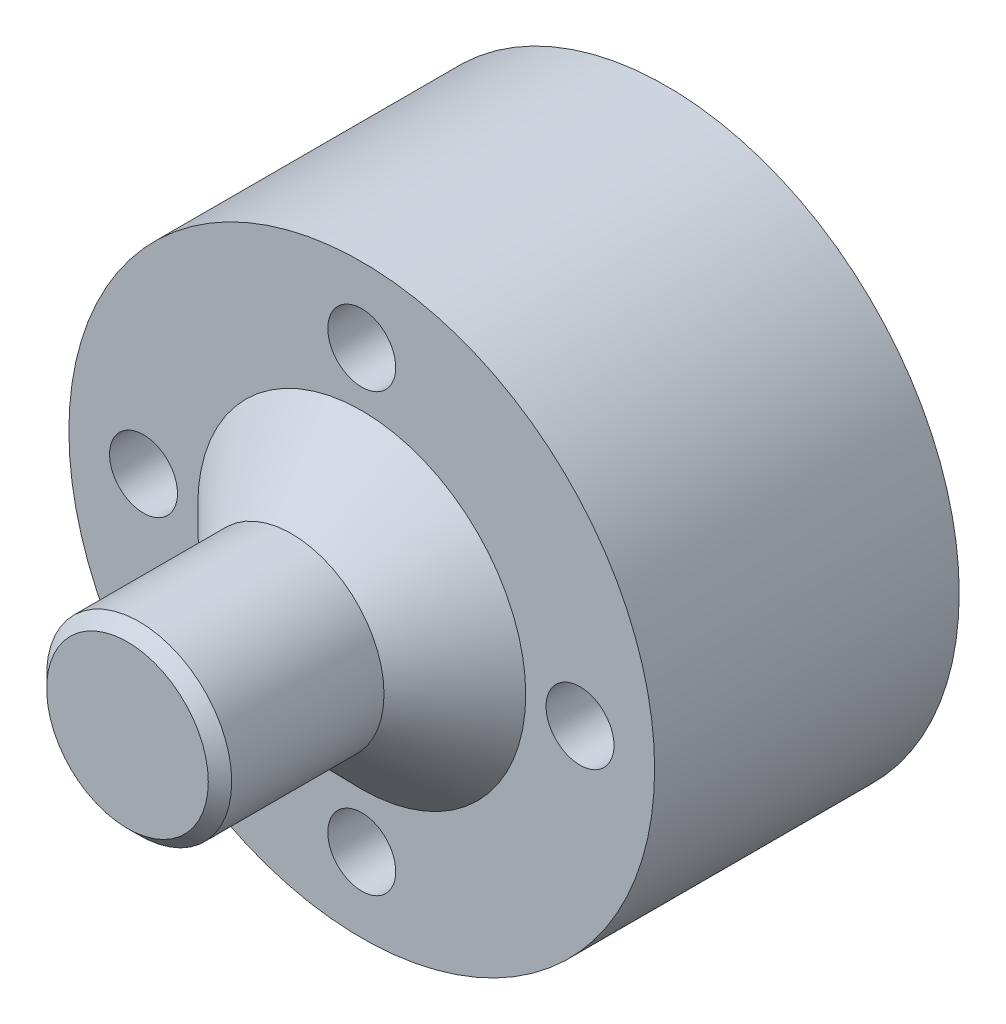
ISO-10303-21;
HEADER;
FILE_DESCRIPTION(('STEP AP214'),'2;1');
FILE_NAME('part.step','',(''),(''),'','','');
FILE_SCHEMA(('AUTOMOTIVE_DESIGN { 1 0 10303 214 1 1 1 1 }'));
ENDSEC;
DATA;
#1=APPLICATION_CONTEXT('core data for automotive mechanical design processes');
#2=APPLICATION_PROTOCOL_DEFINITION('international standard','automotive_design',2000,#1);
#3=PRODUCT_CONTEXT('',#1,'mechanical');
#4=PRODUCT('Part','Part','',(#3));
#5=PRODUCT_RELATED_PRODUCT_CATEGORY('part','',(#4));
#6=PRODUCT_DEFINITION_FORMATION('','',#4);
#7=PRODUCT_DEFINITION_CONTEXT('part definition',#1,'design');
#8=PRODUCT_DEFINITION('design','',#6,#7);
#9=PRODUCT_DEFINITION_SHAPE('','',#8);
#10=(LENGTH_UNIT() NAMED_UNIT(*) SI_UNIT(.MILLI.,.METRE.));
#11=(NAMED_UNIT(*) PLANE_ANGLE_UNIT() SI_UNIT($,.RADIAN.));
#12=(NAMED_UNIT(*) SI_UNIT($,.STERADIAN.) SOLID_ANGLE_UNIT());
#13=UNCERTAINTY_MEASURE_WITH_UNIT(LENGTH_MEASURE(1.E-05),#10,'distance_accuracy_value','');
#14=(GEOMETRIC_REPRESENTATION_CONTEXT(3) GLOBAL_UNCERTAINTY_ASSIGNED_CONTEXT((#13)) GLOBAL_UNIT_ASSIGNED_CONTEXT((#10,
#11,#12)) REPRESENTATION_CONTEXT('',''));
#15=CARTESIAN_POINT('',(0.,0.,0.));
#16=DIRECTION('',(0.,0.,1.));
#17=DIRECTION('',(1.,0.,0.));
#18=AXIS2_PLACEMENT_3D('',#15,#16,#17);
#19=CARTESIAN_POINT('',(0.,0.,4.));
#20=DIRECTION('',(0.,0.,-1.));
#21=DIRECTION('',(-1.,0.,0.));
#22=AXIS2_PLACEMENT_3D('',#19,#20,#21);
#23=CYLINDRICAL_SURFACE('',#22,12.5);
#24=CARTESIAN_POINT('',(0.,0.,-4.));
#25=DIRECTION('',(0.,0.,1.));
#26=DIRECTION('',(1.,0.,0.));
#27=AXIS2_PLACEMENT_3D('',#24,#25,#26);
#28=CIRCLE('',#27,12.5);
#29=CARTESIAN_POINT('',(12.5,0.,-4.));
#30=VERTEX_POINT('',#29);
#31=EDGE_CURVE('E104',#30,#30,#28,.T.);
#32=ORIENTED_EDGE('',*,*,#31,.T.);
#33=EDGE_LOOP('',(#32));
#34=FACE_BOUND('',#33,.T.);
#35=CARTESIAN_POINT('',(0.,0.,9.));
#36=DIRECTION('',(0.,0.,1.));
#37=DIRECTION('',(1.,0.,0.));
#38=AXIS2_PLACEMENT_3D('',#35,#36,#37);
#39=CIRCLE('',#38,12.5);
#40=CARTESIAN_POINT('',(12.5,0.,9.));
#41=VERTEX_POINT('',#40);
#42=EDGE_CURVE('E109',#41,#41,#39,.T.);
#43=ORIENTED_EDGE('',*,*,#42,.F.);
#44=EDGE_LOOP('',(#43));
#45=FACE_BOUND('',#44,.T.);
#46=ADVANCED_FACE('F33',(#34,#45),#23,.T.);
#47=CARTESIAN_POINT('',(0.,0.,-4.));
#48=DIRECTION('',(0.,0.,1.));
#49=DIRECTION('',(1.,0.,0.));
#50=AXIS2_PLACEMENT_3D('',#47,#48,#49);
#51=PLANE('',#50);
#52=CARTESIAN_POINT('',(9.315,0.,-4.));
#53=DIRECTION('',(0.,0.,1.));
#54=DIRECTION('',(1.,0.,0.));
#55=AXIS2_PLACEMENT_3D('',#52,#53,#54);
#56=CIRCLE('',#55,1.45);
#57=CARTESIAN_POINT('',(10.765,0.,-4.));
#58=VERTEX_POINT('',#57);
#59=EDGE_CURVE('E190',#58,#58,#56,.T.);
#60=ORIENTED_EDGE('',*,*,#59,.T.);
#61=EDGE_LOOP('',(#60));
#62=FACE_BOUND('',#61,.T.);
#63=CARTESIAN_POINT('',(0.,-9.315,-4.));
#64=DIRECTION('',(0.,0.,1.));
#65=DIRECTION('',(1.,0.,0.));
#66=AXIS2_PLACEMENT_3D('',#63,#64,#65);
#67=CIRCLE('',#66,1.45);
#68=CARTESIAN_POINT('',(1.44999999999997,-9.315,-4.));
#69=VERTEX_POINT('',#68);
#70=EDGE_CURVE('E193',#69,#69,#67,.T.);
#71=ORIENTED_EDGE('',*,*,#70,.T.);
#72=EDGE_LOOP('',(#71));
#73=FACE_BOUND('',#72,.T.);
#74=CARTESIAN_POINT('',(-9.315,0.,-4.));
#75=DIRECTION('',(0.,0.,1.));
#76=DIRECTION('',(1.,0.,0.));
#77=AXIS2_PLACEMENT_3D('',#74,#75,#76);
#78=CIRCLE('',#77,1.45);
#79=CARTESIAN_POINT('',(-7.865,0.,-4.));
#80=VERTEX_POINT('',#79);
#81=EDGE_CURVE('E196',#80,#80,#78,.T.);
#82=ORIENTED_EDGE('',*,*,#81,.T.);
#83=EDGE_LOOP('',(#82));
#84=FACE_BOUND('',#83,.T.);
#85=CARTESIAN_POINT('',(0.,9.315,-4.));
#86=DIRECTION('',(0.,0.,1.));
#87=DIRECTION('',(1.,0.,0.));
#88=AXIS2_PLACEMENT_3D('',#85,#86,#87);
#89=CIRCLE('',#88,1.45);
#90=CARTESIAN_POINT('',(1.4500000000001,9.315,-4.));
#91=VERTEX_POINT('',#90);
#92=EDGE_CURVE('E189',#91,#91,#89,.T.);
#93=ORIENTED_EDGE('',*,*,#92,.T.);
#94=EDGE_LOOP('',(#93));
#95=FACE_BOUND('',#94,.T.);
#96=DIRECTION('',(-1.,0.,0.));
#97=VECTOR('',#96,1.);
#98=CARTESIAN_POINT('',(-6.125,-6.125,-4.));
#99=LINE('',#98,#97);
#100=CARTESIAN_POINT('',(6.125,-6.125,-4.));
#101=VERTEX_POINT('',#100);
#102=CARTESIAN_POINT('',(-6.125,-6.125,-4.));
#103=VERTEX_POINT('',#102);
#104=EDGE_CURVE('E202',#101,#103,#99,.T.);
#105=ORIENTED_EDGE('',*,*,#104,.F.);
#106=DIRECTION('',(0.,-1.,0.));
#107=VECTOR('',#106,1.);
#108=CARTESIAN_POINT('',(6.125,6.125,-4.));
#109=LINE('',#108,#107);
#110=CARTESIAN_POINT('',(6.125,6.125,-4.));
#111=VERTEX_POINT('',#110);
#112=EDGE_CURVE('E89',#111,#101,#109,.T.);
#113=ORIENTED_EDGE('',*,*,#112,.F.);
#114=DIRECTION('',(1.,0.,0.));
#115=VECTOR('',#114,1.);
#116=CARTESIAN_POINT('',(-6.125,6.125,-4.));
#117=LINE('',#116,#115);
#118=CARTESIAN_POINT('',(-6.125,6.125,-4.));
#119=VERTEX_POINT('',#118);
#120=EDGE_CURVE('E93',#119,#111,#117,.T.);
#121=ORIENTED_EDGE('',*,*,#120,.F.);
#122=DIRECTION('',(0.,1.,0.));
#123=VECTOR('',#122,1.);
#124=CARTESIAN_POINT('',(-6.125,6.125,-4.));
#125=LINE('',#124,#123);
#126=EDGE_CURVE('E48',#103,#119,#125,.T.);
#127=ORIENTED_EDGE('',*,*,#126,.F.);
#128=EDGE_LOOP('',(#105,#113,#121,#127));
#129=FACE_BOUND('',#128,.T.);
#130=ORIENTED_EDGE('',*,*,#31,.F.);
#131=EDGE_LOOP('',(#130));
#132=FACE_BOUND('',#131,.T.);
#133=ADVANCED_FACE('F125',(#62,#73,#84,#95,#129,#132),#51,.F.);
#134=CARTESIAN_POINT('',(6.125,6.125,-4.001));
#135=DIRECTION('',(1.,0.,0.));
#136=DIRECTION('',(0.,1.,0.));
#137=AXIS2_PLACEMENT_3D('',#134,#135,#136);
#138=PLANE('',#137);
#139=ORIENTED_EDGE('',*,*,#112,.T.);
#140=DIRECTION('',(0.,0.,1.));
#141=VECTOR('',#140,1.);
#142=CARTESIAN_POINT('',(6.125,-6.125,-4.001));
#143=LINE('',#142,#141);
#144=CARTESIAN_POINT('',(6.125,-6.125,4.));
#145=VERTEX_POINT('',#144);
#146=EDGE_CURVE('E56',#101,#145,#143,.T.);
#147=ORIENTED_EDGE('',*,*,#146,.T.);
#148=DIRECTION('',(0.,1.,0.));
#149=VECTOR('',#148,1.);
#150=CARTESIAN_POINT('',(6.125,6.125,4.));
#151=LINE('',#150,#149);
#152=CARTESIAN_POINT('',(6.125,6.125,4.));
#153=VERTEX_POINT('',#152);
#154=EDGE_CURVE('E79',#145,#153,#151,.T.);
#155=ORIENTED_EDGE('',*,*,#154,.T.);
#156=DIRECTION('',(0.,0.,1.));
#157=VECTOR('',#156,1.);
#158=CARTESIAN_POINT('',(6.125,6.125,-4.001));
#159=LINE('',#158,#157);
#160=EDGE_CURVE('E87',#111,#153,#159,.T.);
#161=ORIENTED_EDGE('',*,*,#160,.F.);
#162=EDGE_LOOP('',(#139,#147,#155,#161));
#163=FACE_BOUND('',#162,.T.);
#164=ADVANCED_FACE('F86',(#163),#138,.F.);
#165=CARTESIAN_POINT('',(-6.125,-6.125,-4.001));
#166=DIRECTION('',(0.,-1.,0.));
#167=DIRECTION('',(0.,0.,-1.));
#168=AXIS2_PLACEMENT_3D('',#165,#166,#167);
#169=PLANE('',#168);
#170=ORIENTED_EDGE('',*,*,#104,.T.);
#171=DIRECTION('',(0.,0.,1.));
#172=VECTOR('',#171,1.);
#173=CARTESIAN_POINT('',(-6.125,-6.125,-4.001));
#174=LINE('',#173,#172);
#175=CARTESIAN_POINT('',(-6.125,-6.125,4.));
#176=VERTEX_POINT('',#175);
#177=EDGE_CURVE('E98',#103,#176,#174,.T.);
#178=ORIENTED_EDGE('',*,*,#177,.T.);
#179=DIRECTION('',(1.,0.,0.));
#180=VECTOR('',#179,1.);
#181=CARTESIAN_POINT('',(-6.125,-6.125,4.));
#182=LINE('',#181,#180);
#183=EDGE_CURVE('E96',#176,#145,#182,.T.);
#184=ORIENTED_EDGE('',*,*,#183,.T.);
#185=ORIENTED_EDGE('',*,*,#146,.F.);
#186=EDGE_LOOP('',(#170,#178,#184,#185));
#187=FACE_BOUND('',#186,.T.);
#188=ADVANCED_FACE('F136',(#187),#169,.F.);
#189=CARTESIAN_POINT('',(-6.125,6.125,-4.001));
#190=DIRECTION('',(-1.,0.,0.));
#191=DIRECTION('',(0.,-1.,0.));
#192=AXIS2_PLACEMENT_3D('',#189,#190,#191);
#193=PLANE('',#192);
#194=ORIENTED_EDGE('',*,*,#126,.T.);
#195=DIRECTION('',(0.,0.,1.));
#196=VECTOR('',#195,1.);
#197=CARTESIAN_POINT('',(-6.125,6.125,-4.001));
#198=LINE('',#197,#196);
#199=CARTESIAN_POINT('',(-6.125,6.125,4.));
#200=VERTEX_POINT('',#199);
#201=EDGE_CURVE('E95',#119,#200,#198,.T.);
#202=ORIENTED_EDGE('',*,*,#201,.T.);
#203=DIRECTION('',(0.,-1.,0.));
#204=VECTOR('',#203,1.);
#205=CARTESIAN_POINT('',(-6.125,6.125,4.));
#206=LINE('',#205,#204);
#207=EDGE_CURVE('E81',#200,#176,#206,.T.);
#208=ORIENTED_EDGE('',*,*,#207,.T.);
#209=ORIENTED_EDGE('',*,*,#177,.F.);
#210=EDGE_LOOP('',(#194,#202,#208,#209));
#211=FACE_BOUND('',#210,.T.);
#212=ADVANCED_FACE('F140',(#211),#193,.F.);
#213=CARTESIAN_POINT('',(-6.125,6.125,-4.001));
#214=DIRECTION('',(0.,1.,0.));
#215=DIRECTION('',(0.,0.,1.));
#216=AXIS2_PLACEMENT_3D('',#213,#214,#215);
#217=PLANE('',#216);
#218=ORIENTED_EDGE('',*,*,#120,.T.);
#219=ORIENTED_EDGE('',*,*,#160,.T.);
#220=DIRECTION('',(-1.,0.,0.));
#221=VECTOR('',#220,1.);
#222=CARTESIAN_POINT('',(-6.125,6.125,4.));
#223=LINE('',#222,#221);
#224=EDGE_CURVE('E76',#153,#200,#223,.T.);
#225=ORIENTED_EDGE('',*,*,#224,.T.);
#226=ORIENTED_EDGE('',*,*,#201,.F.);
#227=EDGE_LOOP('',(#218,#219,#225,#226));
#228=FACE_BOUND('',#227,.T.);
#229=ADVANCED_FACE('F91',(#228),#217,.F.);
#230=CARTESIAN_POINT('',(0.,9.315,-4.));
#231=DIRECTION('',(0.,0.,1.));
#232=DIRECTION('',(1.,0.,0.));
#233=AXIS2_PLACEMENT_3D('',#230,#231,#232);
#234=CYLINDRICAL_SURFACE('',#233,1.45);
#235=ORIENTED_EDGE('',*,*,#92,.F.);
#236=EDGE_LOOP('',(#235));
#237=FACE_BOUND('',#236,.T.);
#238=CARTESIAN_POINT('',(0.,9.315,9.));
#239=DIRECTION('',(0.,0.,1.));
#240=DIRECTION('',(1.,0.,0.));
#241=AXIS2_PLACEMENT_3D('',#238,#239,#240);
#242=CIRCLE('',#241,1.45);
#243=CARTESIAN_POINT('',(1.4500000000001,9.315,9.));
#244=VERTEX_POINT('',#243);
#245=EDGE_CURVE('E185',#244,#244,#242,.T.);
#246=ORIENTED_EDGE('',*,*,#245,.T.);
#247=EDGE_LOOP('',(#246));
#248=FACE_BOUND('',#247,.T.);
#249=ADVANCED_FACE('F139',(#237,#248),#234,.F.);
#250=CARTESIAN_POINT('',(-9.315,0.,-4.));
#251=DIRECTION('',(0.,0.,1.));
#252=DIRECTION('',(1.,0.,0.));
#253=AXIS2_PLACEMENT_3D('',#250,#251,#252);
#254=CYLINDRICAL_SURFACE('',#253,1.45);
#255=ORIENTED_EDGE('',*,*,#81,.F.);
#256=EDGE_LOOP('',(#255));
#257=FACE_BOUND('',#256,.T.);
#258=CARTESIAN_POINT('',(-9.315,0.,9.));
#259=DIRECTION('',(0.,0.,1.));
#260=DIRECTION('',(1.,0.,0.));
#261=AXIS2_PLACEMENT_3D('',#258,#259,#260);
#262=CIRCLE('',#261,1.45);
#263=CARTESIAN_POINT('',(-7.865,0.,9.));
#264=VERTEX_POINT('',#263);
#265=EDGE_CURVE('E178',#264,#264,#262,.T.);
#266=ORIENTED_EDGE('',*,*,#265,.T.);
#267=EDGE_LOOP('',(#266));
#268=FACE_BOUND('',#267,.T.);
#269=ADVANCED_FACE('F147',(#257,#268),#254,.F.);
#270=CARTESIAN_POINT('',(0.,-9.315,-4.));
#271=DIRECTION('',(0.,0.,1.));
#272=DIRECTION('',(1.,0.,0.));
#273=AXIS2_PLACEMENT_3D('',#270,#271,#272);
#274=CYLINDRICAL_SURFACE('',#273,1.45);
#275=ORIENTED_EDGE('',*,*,#70,.F.);
#276=EDGE_LOOP('',(#275));
#277=FACE_BOUND('',#276,.T.);
#278=CARTESIAN_POINT('',(0.,-9.315,9.));
#279=DIRECTION('',(0.,0.,1.));
#280=DIRECTION('',(1.,0.,0.));
#281=AXIS2_PLACEMENT_3D('',#278,#279,#280);
#282=CIRCLE('',#281,1.45);
#283=CARTESIAN_POINT('',(1.44999999999997,-9.315,9.));
#284=VERTEX_POINT('',#283);
#285=EDGE_CURVE('E181',#284,#284,#282,.T.);
#286=ORIENTED_EDGE('',*,*,#285,.T.);
#287=EDGE_LOOP('',(#286));
#288=FACE_BOUND('',#287,.T.);
#289=ADVANCED_FACE('F151',(#277,#288),#274,.F.);
#290=CARTESIAN_POINT('',(9.315,0.,-4.));
#291=DIRECTION('',(0.,0.,1.));
#292=DIRECTION('',(1.,0.,0.));
#293=AXIS2_PLACEMENT_3D('',#290,#291,#292);
#294=CYLINDRICAL_SURFACE('',#293,1.45);
#295=ORIENTED_EDGE('',*,*,#59,.F.);
#296=EDGE_LOOP('',(#295));
#297=FACE_BOUND('',#296,.T.);
#298=CARTESIAN_POINT('',(9.315,0.,9.));
#299=DIRECTION('',(0.,0.,1.));
#300=DIRECTION('',(1.,0.,0.));
#301=AXIS2_PLACEMENT_3D('',#298,#299,#300);
#302=CIRCLE('',#301,1.45);
#303=CARTESIAN_POINT('',(10.765,0.,9.));
#304=VERTEX_POINT('',#303);
#305=EDGE_CURVE('E217',#304,#304,#302,.T.);
#306=ORIENTED_EDGE('',*,*,#305,.T.);
#307=EDGE_LOOP('',(#306));
#308=FACE_BOUND('',#307,.T.);
#309=ADVANCED_FACE('F155',(#297,#308),#294,.F.);
#310=CARTESIAN_POINT('',(0.,0.,4.));
#311=DIRECTION('',(0.,0.,1.));
#312=DIRECTION('',(1.,0.,0.));
#313=AXIS2_PLACEMENT_3D('',#310,#311,#312);
#314=PLANE('',#313);
#315=ORIENTED_EDGE('',*,*,#154,.F.);
#316=ORIENTED_EDGE('',*,*,#183,.F.);
#317=ORIENTED_EDGE('',*,*,#207,.F.);
#318=ORIENTED_EDGE('',*,*,#224,.F.);
#319=EDGE_LOOP('',(#315,#316,#317,#318));
#320=FACE_BOUND('',#319,.T.);
#321=ADVANCED_FACE('F78',(#320),#314,.F.);
#322=CARTESIAN_POINT('',(0.,0.,9.));
#323=DIRECTION('',(0.,0.,1.));
#324=DIRECTION('',(1.,0.,0.));
#325=AXIS2_PLACEMENT_3D('',#322,#323,#324);
#326=PLANE('',#325);
#327=ORIENTED_EDGE('',*,*,#265,.F.);
#328=EDGE_LOOP('',(#327));
#329=FACE_BOUND('',#328,.T.);
#330=ORIENTED_EDGE('',*,*,#285,.F.);
#331=EDGE_LOOP('',(#330));
#332=FACE_BOUND('',#331,.T.);
#333=ORIENTED_EDGE('',*,*,#305,.F.);
#334=EDGE_LOOP('',(#333));
#335=FACE_BOUND('',#334,.T.);
#336=ORIENTED_EDGE('',*,*,#245,.F.);
#337=EDGE_LOOP('',(#336));
#338=FACE_BOUND('',#337,.T.);
#339=CARTESIAN_POINT('',(0.,0.,9.));
#340=DIRECTION('',(0.,0.,1.));
#341=DIRECTION('',(1.,0.,0.));
#342=AXIS2_PLACEMENT_3D('',#339,#340,#341);
#343=CIRCLE('',#342,6.99872132289265);
#344=CARTESIAN_POINT('',(6.99872132289265,0.,9.));
#345=VERTEX_POINT('',#344);
#346=EDGE_CURVE('E107',#345,#345,#343,.F.);
#347=ORIENTED_EDGE('',*,*,#346,.T.);
#348=EDGE_LOOP('',(#347));
#349=FACE_BOUND('',#348,.T.);
#350=ORIENTED_EDGE('',*,*,#42,.T.);
#351=EDGE_LOOP('',(#350));
#352=FACE_BOUND('',#351,.T.);
#353=ADVANCED_FACE('F162',(#329,#332,#335,#338,#349,#352),#326,.T.);
#354=CARTESIAN_POINT('',(0.,0.,12.));
#355=DIRECTION('',(0.,0.,-1.));
#356=DIRECTION('',(-1.,0.,0.));
#357=AXIS2_PLACEMENT_3D('',#354,#355,#356);
#358=CONICAL_SURFACE('',#357,3.95,0.793452802824974);
#359=ORIENTED_EDGE('',*,*,#346,.F.);
#360=EDGE_LOOP('',(#359));
#361=FACE_BOUND('',#360,.T.);
#362=CARTESIAN_POINT('',(0.,0.,12.));
#363=DIRECTION('',(0.,0.,1.));
#364=DIRECTION('',(1.,0.,0.));
#365=AXIS2_PLACEMENT_3D('',#362,#363,#364);
#366=CIRCLE('',#365,3.95);
#367=CARTESIAN_POINT('',(3.95,0.,12.));
#368=VERTEX_POINT('',#367);
#369=EDGE_CURVE('E110',#368,#368,#366,.T.);
#370=ORIENTED_EDGE('',*,*,#369,.F.);
#371=EDGE_LOOP('',(#370));
#372=FACE_BOUND('',#371,.T.);
#373=ADVANCED_FACE('F165',(#361,#372),#358,.T.);
#374=CARTESIAN_POINT('',(0.,0.,19.));
#375=DIRECTION('',(0.,0.,-1.));
#376=DIRECTION('',(-1.,0.,0.));
#377=AXIS2_PLACEMENT_3D('',#374,#375,#376);
#378=CYLINDRICAL_SURFACE('',#377,3.95);
#379=CARTESIAN_POINT('',(0.,0.,18.5));
#380=DIRECTION('',(0.,0.,1.));
#381=DIRECTION('',(1.,0.,0.));
#382=AXIS2_PLACEMENT_3D('',#379,#380,#381);
#383=CIRCLE('',#382,3.95);
#384=CARTESIAN_POINT('',(3.95,0.,18.5));
#385=VERTEX_POINT('',#384);
#386=EDGE_CURVE('E11',#385,#385,#383,.F.);
#387=ORIENTED_EDGE('',*,*,#386,.T.);
#388=EDGE_LOOP('',(#387));
#389=FACE_BOUND('',#388,.T.);
#390=ORIENTED_EDGE('',*,*,#369,.T.);
#391=EDGE_LOOP('',(#390));
#392=FACE_BOUND('',#391,.T.);
#393=ADVANCED_FACE('F121',(#389,#392),#378,.T.);
#394=CARTESIAN_POINT('',(0.,0.,19.));
#395=DIRECTION('',(0.,0.,1.));
#396=DIRECTION('',(1.,0.,0.));
#397=AXIS2_PLACEMENT_3D('',#394,#395,#396);
#398=PLANE('',#397);
#399=CARTESIAN_POINT('',(0.,0.,19.));
#400=DIRECTION('',(0.,0.,1.));
#401=DIRECTION('',(1.,0.,0.));
#402=AXIS2_PLACEMENT_3D('',#399,#400,#401);
#403=CIRCLE('',#402,3.45);
#404=CARTESIAN_POINT('',(3.45,0.,19.));
#405=VERTEX_POINT('',#404);
#406=EDGE_CURVE('E41',#405,#405,#403,.T.);
#407=ORIENTED_EDGE('',*,*,#406,.T.);
#408=EDGE_LOOP('',(#407));
#409=FACE_BOUND('',#408,.T.);
#410=ADVANCED_FACE('F114',(#409),#398,.T.);
#411=CARTESIAN_POINT('',(0.,0.,19.));
#412=DIRECTION('',(0.,0.,-1.));
#413=DIRECTION('',(-1.,0.,0.));
#414=AXIS2_PLACEMENT_3D('',#411,#412,#413);
#415=CONICAL_SURFACE('',#414,3.45,0.78539816339745);
#416=ORIENTED_EDGE('',*,*,#386,.F.);
#417=EDGE_LOOP('',(#416));
#418=FACE_BOUND('',#417,.T.);
#419=ORIENTED_EDGE('',*,*,#406,.F.);
#420=EDGE_LOOP('',(#419));
#421=FACE_BOUND('',#420,.T.);
#422=ADVANCED_FACE('F35',(#418,#421),#415,.T.);
#423=CLOSED_SHELL('',(#46,#133,#164,#188,#212,#229,#249,#269,#289,#309,#321,#353,#373,#393,#410,#422));
#424=MANIFOLD_SOLID_BREP('B2',#423);
#425=ADVANCED_BREP_SHAPE_REPRESENTATION('',(#18,#424),#14);
#426=SHAPE_DEFINITION_REPRESENTATION(#9,#425);
ENDSEC;
END-ISO-10303-21;
